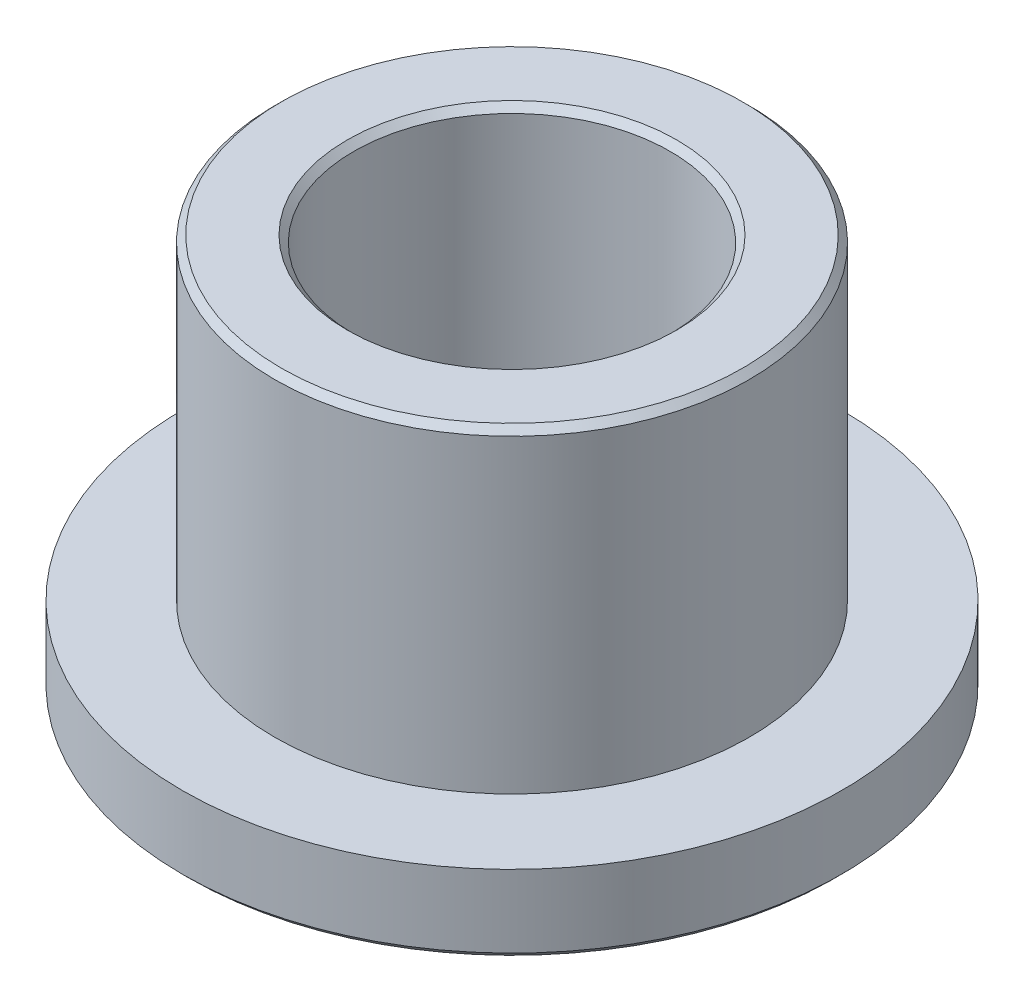
ISO-10303-21;
HEADER;
FILE_DESCRIPTION(('STEP AP214'),'2;1');
FILE_NAME('part.step','',(''),(''),'','','');
FILE_SCHEMA(('AUTOMOTIVE_DESIGN { 1 0 10303 214 1 1 1 1 }'));
ENDSEC;
DATA;
#1=APPLICATION_CONTEXT('core data for automotive mechanical design processes');
#2=APPLICATION_PROTOCOL_DEFINITION('international standard','automotive_design',2000,#1);
#3=PRODUCT_CONTEXT('',#1,'mechanical');
#4=PRODUCT('Part','Part','',(#3));
#5=PRODUCT_RELATED_PRODUCT_CATEGORY('part','',(#4));
#6=PRODUCT_DEFINITION_FORMATION('','',#4);
#7=PRODUCT_DEFINITION_CONTEXT('part definition',#1,'design');
#8=PRODUCT_DEFINITION('design','',#6,#7);
#9=PRODUCT_DEFINITION_SHAPE('','',#8);
#10=(LENGTH_UNIT() NAMED_UNIT(*) SI_UNIT(.MILLI.,.METRE.));
#11=(NAMED_UNIT(*) PLANE_ANGLE_UNIT() SI_UNIT($,.RADIAN.));
#12=(NAMED_UNIT(*) SI_UNIT($,.STERADIAN.) SOLID_ANGLE_UNIT());
#13=UNCERTAINTY_MEASURE_WITH_UNIT(LENGTH_MEASURE(1.E-05),#10,'distance_accuracy_value','');
#14=(GEOMETRIC_REPRESENTATION_CONTEXT(3) GLOBAL_UNCERTAINTY_ASSIGNED_CONTEXT((#13)) GLOBAL_UNIT_ASSIGNED_CONTEXT((#10,
#11,#12)) REPRESENTATION_CONTEXT('',''));
#15=CARTESIAN_POINT('',(0.,0.,0.));
#16=DIRECTION('',(0.,0.,1.));
#17=DIRECTION('',(1.,0.,0.));
#18=AXIS2_PLACEMENT_3D('',#15,#16,#17);
#19=CARTESIAN_POINT('',(0.,3.,0.));
#20=DIRECTION('',(0.,1.,0.));
#21=DIRECTION('',(0.,0.,1.));
#22=AXIS2_PLACEMENT_3D('',#19,#20,#21);
#23=PLANE('',#22);
#24=CARTESIAN_POINT('',(0.,3.,0.));
#25=DIRECTION('',(0.,1.,0.));
#26=DIRECTION('',(0.,0.,1.));
#27=AXIS2_PLACEMENT_3D('',#24,#25,#26);
#28=CIRCLE('',#27,12.5);
#29=CARTESIAN_POINT('',(0.,3.,12.5));
#30=VERTEX_POINT('',#29);
#31=EDGE_CURVE('E83',#30,#30,#28,.T.);
#32=ORIENTED_EDGE('',*,*,#31,.T.);
#33=EDGE_LOOP('',(#32));
#34=FACE_BOUND('',#33,.T.);
#35=CARTESIAN_POINT('',(0.,3.,0.));
#36=DIRECTION('',(0.,1.,0.));
#37=DIRECTION('',(0.,0.,1.));
#38=AXIS2_PLACEMENT_3D('',#35,#36,#37);
#39=CIRCLE('',#38,9.);
#40=CARTESIAN_POINT('',(0.,3.,9.));
#41=VERTEX_POINT('',#40);
#42=EDGE_CURVE('E87',#41,#41,#39,.T.);
#43=ORIENTED_EDGE('',*,*,#42,.F.);
#44=EDGE_LOOP('',(#43));
#45=FACE_BOUND('',#44,.T.);
#46=ADVANCED_FACE('F40',(#34,#45),#23,.T.);
#47=CARTESIAN_POINT('',(0.,0.,0.));
#48=DIRECTION('',(0.,1.,0.));
#49=DIRECTION('',(0.,0.,1.));
#50=AXIS2_PLACEMENT_3D('',#47,#48,#49);
#51=PLANE('',#50);
#52=CARTESIAN_POINT('',(0.,0.,0.));
#53=DIRECTION('',(0.,1.,0.));
#54=DIRECTION('',(0.,0.,1.));
#55=AXIS2_PLACEMENT_3D('',#52,#53,#54);
#56=CIRCLE('',#55,6.25);
#57=CARTESIAN_POINT('',(0.,0.,6.25));
#58=VERTEX_POINT('',#57);
#59=EDGE_CURVE('E75',#58,#58,#56,.T.);
#60=ORIENTED_EDGE('',*,*,#59,.T.);
#61=EDGE_LOOP('',(#60));
#62=FACE_BOUND('',#61,.T.);
#63=CARTESIAN_POINT('',(0.,0.,0.));
#64=DIRECTION('',(0.,1.,0.));
#65=DIRECTION('',(0.,0.,1.));
#66=AXIS2_PLACEMENT_3D('',#63,#64,#65);
#67=CIRCLE('',#66,12.25);
#68=CARTESIAN_POINT('',(0.,0.,12.25));
#69=VERTEX_POINT('',#68);
#70=EDGE_CURVE('E79',#69,#69,#67,.F.);
#71=ORIENTED_EDGE('',*,*,#70,.T.);
#72=EDGE_LOOP('',(#71));
#73=FACE_BOUND('',#72,.T.);
#74=ADVANCED_FACE('F96',(#62,#73),#51,.F.);
#75=CARTESIAN_POINT('',(0.,3.,0.));
#76=DIRECTION('',(0.,-1.,0.));
#77=DIRECTION('',(0.,0.,-1.));
#78=AXIS2_PLACEMENT_3D('',#75,#76,#77);
#79=CYLINDRICAL_SURFACE('',#78,12.5);
#80=CARTESIAN_POINT('',(0.,0.25,0.));
#81=DIRECTION('',(0.,1.,0.));
#82=DIRECTION('',(0.,0.,1.));
#83=AXIS2_PLACEMENT_3D('',#80,#81,#82);
#84=CIRCLE('',#83,12.5);
#85=CARTESIAN_POINT('',(0.,0.25,12.5));
#86=VERTEX_POINT('',#85);
#87=EDGE_CURVE('E61',#86,#86,#84,.T.);
#88=ORIENTED_EDGE('',*,*,#87,.T.);
#89=EDGE_LOOP('',(#88));
#90=FACE_BOUND('',#89,.T.);
#91=ORIENTED_EDGE('',*,*,#31,.F.);
#92=EDGE_LOOP('',(#91));
#93=FACE_BOUND('',#92,.T.);
#94=ADVANCED_FACE('F102',(#90,#93),#79,.T.);
#95=CARTESIAN_POINT('',(0.,3.,0.));
#96=DIRECTION('',(0.,-1.,0.));
#97=DIRECTION('',(0.,0.,-1.));
#98=AXIS2_PLACEMENT_3D('',#95,#96,#97);
#99=CYLINDRICAL_SURFACE('',#98,6.);
#100=CARTESIAN_POINT('',(0.,0.25,0.));
#101=DIRECTION('',(0.,1.,0.));
#102=DIRECTION('',(0.,0.,1.));
#103=AXIS2_PLACEMENT_3D('',#100,#101,#102);
#104=CIRCLE('',#103,6.);
#105=CARTESIAN_POINT('',(0.,0.25,6.));
#106=VERTEX_POINT('',#105);
#107=EDGE_CURVE('E67',#106,#106,#104,.F.);
#108=ORIENTED_EDGE('',*,*,#107,.T.);
#109=EDGE_LOOP('',(#108));
#110=FACE_BOUND('',#109,.T.);
#111=CARTESIAN_POINT('',(0.,14.75,0.));
#112=DIRECTION('',(0.,1.,0.));
#113=DIRECTION('',(0.,0.,1.));
#114=AXIS2_PLACEMENT_3D('',#111,#112,#113);
#115=CIRCLE('',#114,6.);
#116=CARTESIAN_POINT('',(0.,14.75,6.));
#117=VERTEX_POINT('',#116);
#118=EDGE_CURVE('E71',#117,#117,#115,.T.);
#119=ORIENTED_EDGE('',*,*,#118,.T.);
#120=EDGE_LOOP('',(#119));
#121=FACE_BOUND('',#120,.T.);
#122=ADVANCED_FACE('F106',(#110,#121),#99,.F.);
#123=CARTESIAN_POINT('',(0.,15.,0.));
#124=DIRECTION('',(0.,1.,0.));
#125=DIRECTION('',(0.,0.,1.));
#126=AXIS2_PLACEMENT_3D('',#123,#124,#125);
#127=PLANE('',#126);
#128=CARTESIAN_POINT('',(0.,15.,0.));
#129=DIRECTION('',(0.,1.,0.));
#130=DIRECTION('',(0.,0.,1.));
#131=AXIS2_PLACEMENT_3D('',#128,#129,#130);
#132=CIRCLE('',#131,6.25000000000001);
#133=CARTESIAN_POINT('',(0.,15.,6.25000000000001));
#134=VERTEX_POINT('',#133);
#135=EDGE_CURVE('E49',#134,#134,#132,.F.);
#136=ORIENTED_EDGE('',*,*,#135,.T.);
#137=EDGE_LOOP('',(#136));
#138=FACE_BOUND('',#137,.T.);
#139=CARTESIAN_POINT('',(0.,15.,0.));
#140=DIRECTION('',(0.,1.,0.));
#141=DIRECTION('',(0.,0.,1.));
#142=AXIS2_PLACEMENT_3D('',#139,#140,#141);
#143=CIRCLE('',#142,8.74999999999999);
#144=CARTESIAN_POINT('',(0.,15.,8.74999999999999));
#145=VERTEX_POINT('',#144);
#146=EDGE_CURVE('E55',#145,#145,#143,.T.);
#147=ORIENTED_EDGE('',*,*,#146,.T.);
#148=EDGE_LOOP('',(#147));
#149=FACE_BOUND('',#148,.T.);
#150=ADVANCED_FACE('F139',(#138,#149),#127,.T.);
#151=CARTESIAN_POINT('',(0.,15.,0.));
#152=DIRECTION('',(0.,-1.,0.));
#153=DIRECTION('',(0.,0.,-1.));
#154=AXIS2_PLACEMENT_3D('',#151,#152,#153);
#155=CYLINDRICAL_SURFACE('',#154,9.);
#156=CARTESIAN_POINT('',(0.,14.75,0.));
#157=DIRECTION('',(0.,1.,0.));
#158=DIRECTION('',(0.,0.,1.));
#159=AXIS2_PLACEMENT_3D('',#156,#157,#158);
#160=CIRCLE('',#159,9.);
#161=CARTESIAN_POINT('',(0.,14.75,9.));
#162=VERTEX_POINT('',#161);
#163=EDGE_CURVE('E10',#162,#162,#160,.F.);
#164=ORIENTED_EDGE('',*,*,#163,.T.);
#165=EDGE_LOOP('',(#164));
#166=FACE_BOUND('',#165,.T.);
#167=ORIENTED_EDGE('',*,*,#42,.T.);
#168=EDGE_LOOP('',(#167));
#169=FACE_BOUND('',#168,.T.);
#170=ADVANCED_FACE('F93',(#166,#169),#155,.T.);
#171=CARTESIAN_POINT('',(0.,0.,0.));
#172=DIRECTION('',(0.,-1.,0.));
#173=DIRECTION('',(0.,0.,-1.));
#174=AXIS2_PLACEMENT_3D('',#171,#172,#173);
#175=CONICAL_SURFACE('',#174,6.25,0.78539816339745);
#176=ORIENTED_EDGE('',*,*,#107,.F.);
#177=EDGE_LOOP('',(#176));
#178=FACE_BOUND('',#177,.T.);
#179=ORIENTED_EDGE('',*,*,#59,.F.);
#180=EDGE_LOOP('',(#179));
#181=FACE_BOUND('',#180,.T.);
#182=ADVANCED_FACE('F113',(#178,#181),#175,.F.);
#183=CARTESIAN_POINT('',(0.,0.25,0.));
#184=DIRECTION('',(0.,1.,0.));
#185=DIRECTION('',(0.,0.,1.));
#186=AXIS2_PLACEMENT_3D('',#183,#184,#185);
#187=CONICAL_SURFACE('',#186,12.5,0.785398163397448);
#188=ORIENTED_EDGE('',*,*,#70,.F.);
#189=EDGE_LOOP('',(#188));
#190=FACE_BOUND('',#189,.T.);
#191=ORIENTED_EDGE('',*,*,#87,.F.);
#192=EDGE_LOOP('',(#191));
#193=FACE_BOUND('',#192,.T.);
#194=ADVANCED_FACE('F119',(#190,#193),#187,.T.);
#195=CARTESIAN_POINT('',(0.,14.75,0.));
#196=DIRECTION('',(0.,1.,0.));
#197=DIRECTION('',(0.,0.,1.));
#198=AXIS2_PLACEMENT_3D('',#195,#196,#197);
#199=CONICAL_SURFACE('',#198,6.,0.785398163397459);
#200=ORIENTED_EDGE('',*,*,#135,.F.);
#201=EDGE_LOOP('',(#200));
#202=FACE_BOUND('',#201,.T.);
#203=ORIENTED_EDGE('',*,*,#118,.F.);
#204=EDGE_LOOP('',(#203));
#205=FACE_BOUND('',#204,.T.);
#206=ADVANCED_FACE('F125',(#202,#205),#199,.F.);
#207=CARTESIAN_POINT('',(0.,15.,0.));
#208=DIRECTION('',(0.,-1.,0.));
#209=DIRECTION('',(0.,0.,-1.));
#210=AXIS2_PLACEMENT_3D('',#207,#208,#209);
#211=CONICAL_SURFACE('',#210,8.74999999999999,0.785398163397441);
#212=ORIENTED_EDGE('',*,*,#163,.F.);
#213=EDGE_LOOP('',(#212));
#214=FACE_BOUND('',#213,.T.);
#215=ORIENTED_EDGE('',*,*,#146,.F.);
#216=EDGE_LOOP('',(#215));
#217=FACE_BOUND('',#216,.T.);
#218=ADVANCED_FACE('F43',(#214,#217),#211,.T.);
#219=CLOSED_SHELL('',(#46,#74,#94,#122,#150,#170,#182,#194,#206,#218));
#220=MANIFOLD_SOLID_BREP('B2',#219);
#221=ADVANCED_BREP_SHAPE_REPRESENTATION('',(#18,#220),#14);
#222=SHAPE_DEFINITION_REPRESENTATION(#9,#221);
ENDSEC;
END-ISO-10303-21;
